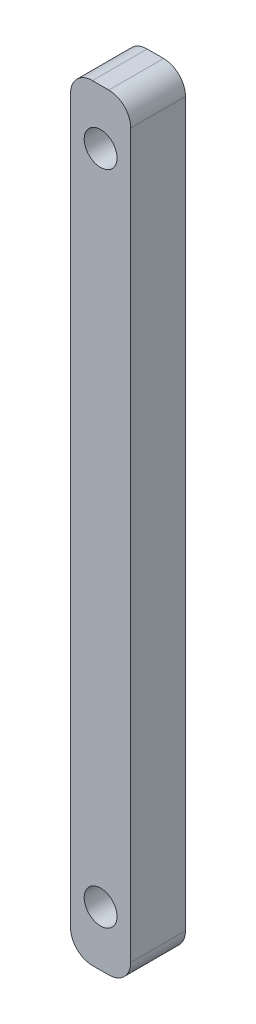
ISO-10303-21;
HEADER;
FILE_DESCRIPTION(('STEP AP214'),'2;1');
FILE_NAME('part.step','',(''),(''),'','','');
FILE_SCHEMA(('AUTOMOTIVE_DESIGN { 1 0 10303 214 1 1 1 1 }'));
ENDSEC;
DATA;
#1=APPLICATION_CONTEXT('core data for automotive mechanical design processes');
#2=APPLICATION_PROTOCOL_DEFINITION('international standard','automotive_design',2000,#1);
#3=PRODUCT_CONTEXT('',#1,'mechanical');
#4=PRODUCT('Part','Part','',(#3));
#5=PRODUCT_RELATED_PRODUCT_CATEGORY('part','',(#4));
#6=PRODUCT_DEFINITION_FORMATION('','',#4);
#7=PRODUCT_DEFINITION_CONTEXT('part definition',#1,'design');
#8=PRODUCT_DEFINITION('design','',#6,#7);
#9=PRODUCT_DEFINITION_SHAPE('','',#8);
#10=(LENGTH_UNIT() NAMED_UNIT(*) SI_UNIT(.MILLI.,.METRE.));
#11=(NAMED_UNIT(*) PLANE_ANGLE_UNIT() SI_UNIT($,.RADIAN.));
#12=(NAMED_UNIT(*) SI_UNIT($,.STERADIAN.) SOLID_ANGLE_UNIT());
#13=UNCERTAINTY_MEASURE_WITH_UNIT(LENGTH_MEASURE(1.E-05),#10,'distance_accuracy_value','');
#14=(GEOMETRIC_REPRESENTATION_CONTEXT(3) GLOBAL_UNCERTAINTY_ASSIGNED_CONTEXT((#13)) GLOBAL_UNIT_ASSIGNED_CONTEXT((#10,
#11,#12)) REPRESENTATION_CONTEXT('',''));
#15=CARTESIAN_POINT('',(0.,0.,0.));
#16=DIRECTION('',(0.,0.,1.));
#17=DIRECTION('',(1.,0.,0.));
#18=AXIS2_PLACEMENT_3D('',#15,#16,#17);
#19=CARTESIAN_POINT('',(-2.75,-35.,5.));
#20=DIRECTION('',(1.,0.,0.));
#21=DIRECTION('',(0.,0.,-1.));
#22=AXIS2_PLACEMENT_3D('',#19,#20,#21);
#23=PLANE('',#22);
#24=DIRECTION('',(0.,-1.,0.));
#25=VECTOR('',#24,1.);
#26=CARTESIAN_POINT('',(-2.75,-35.,0.));
#27=LINE('',#26,#25);
#28=CARTESIAN_POINT('',(-2.75,33.,0.));
#29=VERTEX_POINT('',#28);
#30=CARTESIAN_POINT('',(-2.75,-33.,0.));
#31=VERTEX_POINT('',#30);
#32=EDGE_CURVE('E134',#29,#31,#27,.T.);
#33=ORIENTED_EDGE('',*,*,#32,.T.);
#34=DIRECTION('',(0.,0.,-1.));
#35=VECTOR('',#34,1.);
#36=CARTESIAN_POINT('',(-2.75,-33.,5.));
#37=LINE('',#36,#35);
#38=CARTESIAN_POINT('',(-2.75,-33.,5.));
#39=VERTEX_POINT('',#38);
#40=EDGE_CURVE('E112',#31,#39,#37,.F.);
#41=ORIENTED_EDGE('',*,*,#40,.T.);
#42=DIRECTION('',(0.,-1.,0.));
#43=VECTOR('',#42,1.);
#44=CARTESIAN_POINT('',(-2.75,-35.,5.));
#45=LINE('',#44,#43);
#46=CARTESIAN_POINT('',(-2.75,33.,5.));
#47=VERTEX_POINT('',#46);
#48=EDGE_CURVE('E144',#47,#39,#45,.T.);
#49=ORIENTED_EDGE('',*,*,#48,.F.);
#50=DIRECTION('',(0.,0.,-1.));
#51=VECTOR('',#50,1.);
#52=CARTESIAN_POINT('',(-2.75,33.,5.));
#53=LINE('',#52,#51);
#54=EDGE_CURVE('E117',#47,#29,#53,.T.);
#55=ORIENTED_EDGE('',*,*,#54,.T.);
#56=EDGE_LOOP('',(#33,#41,#49,#55));
#57=FACE_BOUND('',#56,.T.);
#58=ADVANCED_FACE('F41',(#57),#23,.F.);
#59=CARTESIAN_POINT('',(2.75,-35.,5.));
#60=DIRECTION('',(0.,1.,0.));
#61=DIRECTION('',(0.,0.,1.));
#62=AXIS2_PLACEMENT_3D('',#59,#60,#61);
#63=PLANE('',#62);
#64=DIRECTION('',(1.,0.,0.));
#65=VECTOR('',#64,1.);
#66=CARTESIAN_POINT('',(2.75,-35.,5.));
#67=LINE('',#66,#65);
#68=CARTESIAN_POINT('',(-0.749999999999999,-35.,5.));
#69=VERTEX_POINT('',#68);
#70=CARTESIAN_POINT('',(0.75,-35.,5.));
#71=VERTEX_POINT('',#70);
#72=EDGE_CURVE('E127',#69,#71,#67,.T.);
#73=ORIENTED_EDGE('',*,*,#72,.F.);
#74=DIRECTION('',(0.,0.,-1.));
#75=VECTOR('',#74,1.);
#76=CARTESIAN_POINT('',(-0.749999999999999,-35.,5.));
#77=LINE('',#76,#75);
#78=CARTESIAN_POINT('',(-0.749999999999999,-35.,0.));
#79=VERTEX_POINT('',#78);
#80=EDGE_CURVE('E111',#69,#79,#77,.T.);
#81=ORIENTED_EDGE('',*,*,#80,.T.);
#82=DIRECTION('',(1.,0.,0.));
#83=VECTOR('',#82,1.);
#84=CARTESIAN_POINT('',(2.75,-35.,0.));
#85=LINE('',#84,#83);
#86=CARTESIAN_POINT('',(0.75,-35.,0.));
#87=VERTEX_POINT('',#86);
#88=EDGE_CURVE('E124',#79,#87,#85,.T.);
#89=ORIENTED_EDGE('',*,*,#88,.T.);
#90=DIRECTION('',(0.,0.,-1.));
#91=VECTOR('',#90,1.);
#92=CARTESIAN_POINT('',(0.75,-35.,5.));
#93=LINE('',#92,#91);
#94=EDGE_CURVE('E129',#87,#71,#93,.F.);
#95=ORIENTED_EDGE('',*,*,#94,.T.);
#96=EDGE_LOOP('',(#73,#81,#89,#95));
#97=FACE_BOUND('',#96,.T.);
#98=ADVANCED_FACE('F123',(#97),#63,.F.);
#99=CARTESIAN_POINT('',(2.75,-35.,5.));
#100=DIRECTION('',(-1.,0.,0.));
#101=DIRECTION('',(0.,0.,1.));
#102=AXIS2_PLACEMENT_3D('',#99,#100,#101);
#103=PLANE('',#102);
#104=DIRECTION('',(0.,1.,0.));
#105=VECTOR('',#104,1.);
#106=CARTESIAN_POINT('',(2.75,-35.,5.));
#107=LINE('',#106,#105);
#108=CARTESIAN_POINT('',(2.75,-33.,5.));
#109=VERTEX_POINT('',#108);
#110=CARTESIAN_POINT('',(2.75,33.,5.));
#111=VERTEX_POINT('',#110);
#112=EDGE_CURVE('E170',#109,#111,#107,.T.);
#113=ORIENTED_EDGE('',*,*,#112,.F.);
#114=DIRECTION('',(0.,0.,-1.));
#115=VECTOR('',#114,1.);
#116=CARTESIAN_POINT('',(2.75,-33.,5.));
#117=LINE('',#116,#115);
#118=CARTESIAN_POINT('',(2.75,-33.,0.));
#119=VERTEX_POINT('',#118);
#120=EDGE_CURVE('E163',#109,#119,#117,.T.);
#121=ORIENTED_EDGE('',*,*,#120,.T.);
#122=DIRECTION('',(0.,1.,0.));
#123=VECTOR('',#122,1.);
#124=CARTESIAN_POINT('',(2.75,-35.,0.));
#125=LINE('',#124,#123);
#126=CARTESIAN_POINT('',(2.75,33.,0.));
#127=VERTEX_POINT('',#126);
#128=EDGE_CURVE('E133',#119,#127,#125,.T.);
#129=ORIENTED_EDGE('',*,*,#128,.T.);
#130=DIRECTION('',(0.,0.,-1.));
#131=VECTOR('',#130,1.);
#132=CARTESIAN_POINT('',(2.75,33.,5.));
#133=LINE('',#132,#131);
#134=EDGE_CURVE('E161',#127,#111,#133,.F.);
#135=ORIENTED_EDGE('',*,*,#134,.T.);
#136=EDGE_LOOP('',(#113,#121,#129,#135));
#137=FACE_BOUND('',#136,.T.);
#138=ADVANCED_FACE('F168',(#137),#103,.F.);
#139=CARTESIAN_POINT('',(2.75,35.,5.));
#140=DIRECTION('',(0.,-1.,0.));
#141=DIRECTION('',(0.,0.,-1.));
#142=AXIS2_PLACEMENT_3D('',#139,#140,#141);
#143=PLANE('',#142);
#144=DIRECTION('',(-1.,0.,0.));
#145=VECTOR('',#144,1.);
#146=CARTESIAN_POINT('',(2.75,35.,5.));
#147=LINE('',#146,#145);
#148=CARTESIAN_POINT('',(0.75,35.,5.));
#149=VERTEX_POINT('',#148);
#150=CARTESIAN_POINT('',(-0.749999999999999,35.,5.));
#151=VERTEX_POINT('',#150);
#152=EDGE_CURVE('E145',#149,#151,#147,.T.);
#153=ORIENTED_EDGE('',*,*,#152,.F.);
#154=DIRECTION('',(0.,0.,-1.));
#155=VECTOR('',#154,1.);
#156=CARTESIAN_POINT('',(0.75,35.,5.));
#157=LINE('',#156,#155);
#158=CARTESIAN_POINT('',(0.75,35.,0.));
#159=VERTEX_POINT('',#158);
#160=EDGE_CURVE('E11',#149,#159,#157,.T.);
#161=ORIENTED_EDGE('',*,*,#160,.T.);
#162=DIRECTION('',(-1.,0.,0.));
#163=VECTOR('',#162,1.);
#164=CARTESIAN_POINT('',(2.75,35.,0.));
#165=LINE('',#164,#163);
#166=CARTESIAN_POINT('',(-0.749999999999999,35.,0.));
#167=VERTEX_POINT('',#166);
#168=EDGE_CURVE('E137',#159,#167,#165,.T.);
#169=ORIENTED_EDGE('',*,*,#168,.T.);
#170=DIRECTION('',(0.,0.,-1.));
#171=VECTOR('',#170,1.);
#172=CARTESIAN_POINT('',(-0.749999999999999,35.,5.));
#173=LINE('',#172,#171);
#174=EDGE_CURVE('E49',#167,#151,#173,.F.);
#175=ORIENTED_EDGE('',*,*,#174,.T.);
#176=EDGE_LOOP('',(#153,#161,#169,#175));
#177=FACE_BOUND('',#176,.T.);
#178=ADVANCED_FACE('F177',(#177),#143,.F.);
#179=CARTESIAN_POINT('',(0.,0.,5.));
#180=DIRECTION('',(0.,0.,1.));
#181=DIRECTION('',(1.,0.,0.));
#182=AXIS2_PLACEMENT_3D('',#179,#180,#181);
#183=PLANE('',#182);
#184=CARTESIAN_POINT('',(0.,30.,5.));
#185=DIRECTION('',(0.,0.,1.));
#186=DIRECTION('',(1.,0.,0.));
#187=AXIS2_PLACEMENT_3D('',#184,#185,#186);
#188=CIRCLE('',#187,1.5);
#189=CARTESIAN_POINT('',(1.5,30.,5.));
#190=VERTEX_POINT('',#189);
#191=EDGE_CURVE('E190',#190,#190,#188,.T.);
#192=ORIENTED_EDGE('',*,*,#191,.F.);
#193=EDGE_LOOP('',(#192));
#194=FACE_BOUND('',#193,.T.);
#195=CARTESIAN_POINT('',(0.,-30.,5.));
#196=DIRECTION('',(0.,0.,1.));
#197=DIRECTION('',(1.,0.,0.));
#198=AXIS2_PLACEMENT_3D('',#195,#196,#197);
#199=CIRCLE('',#198,1.5);
#200=CARTESIAN_POINT('',(1.50000000000001,-30.,5.));
#201=VERTEX_POINT('',#200);
#202=EDGE_CURVE('E187',#201,#201,#199,.T.);
#203=ORIENTED_EDGE('',*,*,#202,.F.);
#204=EDGE_LOOP('',(#203));
#205=FACE_BOUND('',#204,.T.);
#206=ORIENTED_EDGE('',*,*,#48,.T.);
#207=CARTESIAN_POINT('',(-0.749999999999999,-33.,5.));
#208=DIRECTION('',(0.,0.,1.));
#209=DIRECTION('',(1.,0.,0.));
#210=AXIS2_PLACEMENT_3D('',#207,#208,#209);
#211=CIRCLE('',#210,2.);
#212=EDGE_CURVE('E159',#39,#69,#211,.T.);
#213=ORIENTED_EDGE('',*,*,#212,.T.);
#214=ORIENTED_EDGE('',*,*,#72,.T.);
#215=CARTESIAN_POINT('',(0.75,-33.,5.));
#216=DIRECTION('',(0.,0.,1.));
#217=DIRECTION('',(1.,0.,0.));
#218=AXIS2_PLACEMENT_3D('',#215,#216,#217);
#219=CIRCLE('',#218,2.);
#220=EDGE_CURVE('E157',#71,#109,#219,.T.);
#221=ORIENTED_EDGE('',*,*,#220,.T.);
#222=ORIENTED_EDGE('',*,*,#112,.T.);
#223=CARTESIAN_POINT('',(0.75,33.,5.));
#224=DIRECTION('',(0.,0.,1.));
#225=DIRECTION('',(1.,0.,0.));
#226=AXIS2_PLACEMENT_3D('',#223,#224,#225);
#227=CIRCLE('',#226,2.);
#228=EDGE_CURVE('E62',#111,#149,#227,.T.);
#229=ORIENTED_EDGE('',*,*,#228,.T.);
#230=ORIENTED_EDGE('',*,*,#152,.T.);
#231=CARTESIAN_POINT('',(-0.749999999999999,33.,5.));
#232=DIRECTION('',(0.,0.,1.));
#233=DIRECTION('',(1.,0.,0.));
#234=AXIS2_PLACEMENT_3D('',#231,#232,#233);
#235=CIRCLE('',#234,2.);
#236=EDGE_CURVE('E154',#151,#47,#235,.T.);
#237=ORIENTED_EDGE('',*,*,#236,.T.);
#238=EDGE_LOOP('',(#206,#213,#214,#221,#222,#229,#230,#237));
#239=FACE_BOUND('',#238,.T.);
#240=ADVANCED_FACE('F205',(#194,#205,#239),#183,.T.);
#241=CARTESIAN_POINT('',(0.,0.,0.));
#242=DIRECTION('',(0.,0.,1.));
#243=DIRECTION('',(1.,0.,0.));
#244=AXIS2_PLACEMENT_3D('',#241,#242,#243);
#245=PLANE('',#244);
#246=CARTESIAN_POINT('',(0.,30.,0.));
#247=DIRECTION('',(0.,0.,1.));
#248=DIRECTION('',(1.,0.,0.));
#249=AXIS2_PLACEMENT_3D('',#246,#247,#248);
#250=CIRCLE('',#249,1.5);
#251=CARTESIAN_POINT('',(1.5,30.,0.));
#252=VERTEX_POINT('',#251);
#253=EDGE_CURVE('E139',#252,#252,#250,.T.);
#254=ORIENTED_EDGE('',*,*,#253,.T.);
#255=EDGE_LOOP('',(#254));
#256=FACE_BOUND('',#255,.T.);
#257=CARTESIAN_POINT('',(0.,-30.,0.));
#258=DIRECTION('',(0.,0.,1.));
#259=DIRECTION('',(1.,0.,0.));
#260=AXIS2_PLACEMENT_3D('',#257,#258,#259);
#261=CIRCLE('',#260,1.5);
#262=CARTESIAN_POINT('',(1.50000000000001,-30.,0.));
#263=VERTEX_POINT('',#262);
#264=EDGE_CURVE('E184',#263,#263,#261,.T.);
#265=ORIENTED_EDGE('',*,*,#264,.T.);
#266=EDGE_LOOP('',(#265));
#267=FACE_BOUND('',#266,.T.);
#268=ORIENTED_EDGE('',*,*,#88,.F.);
#269=CARTESIAN_POINT('',(-0.749999999999999,-33.,0.));
#270=DIRECTION('',(0.,0.,1.));
#271=DIRECTION('',(1.,0.,0.));
#272=AXIS2_PLACEMENT_3D('',#269,#270,#271);
#273=CIRCLE('',#272,2.);
#274=EDGE_CURVE('E107',#79,#31,#273,.F.);
#275=ORIENTED_EDGE('',*,*,#274,.T.);
#276=ORIENTED_EDGE('',*,*,#32,.F.);
#277=CARTESIAN_POINT('',(-0.749999999999999,33.,0.));
#278=DIRECTION('',(0.,0.,1.));
#279=DIRECTION('',(1.,0.,0.));
#280=AXIS2_PLACEMENT_3D('',#277,#278,#279);
#281=CIRCLE('',#280,2.);
#282=EDGE_CURVE('E128',#29,#167,#281,.F.);
#283=ORIENTED_EDGE('',*,*,#282,.T.);
#284=ORIENTED_EDGE('',*,*,#168,.F.);
#285=CARTESIAN_POINT('',(0.75,33.,0.));
#286=DIRECTION('',(0.,0.,1.));
#287=DIRECTION('',(1.,0.,0.));
#288=AXIS2_PLACEMENT_3D('',#285,#286,#287);
#289=CIRCLE('',#288,2.);
#290=EDGE_CURVE('E148',#159,#127,#289,.F.);
#291=ORIENTED_EDGE('',*,*,#290,.T.);
#292=ORIENTED_EDGE('',*,*,#128,.F.);
#293=CARTESIAN_POINT('',(0.75,-33.,0.));
#294=DIRECTION('',(0.,0.,1.));
#295=DIRECTION('',(1.,0.,0.));
#296=AXIS2_PLACEMENT_3D('',#293,#294,#295);
#297=CIRCLE('',#296,2.);
#298=EDGE_CURVE('E118',#119,#87,#297,.F.);
#299=ORIENTED_EDGE('',*,*,#298,.T.);
#300=EDGE_LOOP('',(#268,#275,#276,#283,#284,#291,#292,#299));
#301=FACE_BOUND('',#300,.T.);
#302=ADVANCED_FACE('F131',(#256,#267,#301),#245,.F.);
#303=CARTESIAN_POINT('',(0.,-30.,0.));
#304=DIRECTION('',(0.,0.,1.));
#305=DIRECTION('',(1.,0.,0.));
#306=AXIS2_PLACEMENT_3D('',#303,#304,#305);
#307=CYLINDRICAL_SURFACE('',#306,1.5);
#308=ORIENTED_EDGE('',*,*,#264,.F.);
#309=EDGE_LOOP('',(#308));
#310=FACE_BOUND('',#309,.T.);
#311=ORIENTED_EDGE('',*,*,#202,.T.);
#312=EDGE_LOOP('',(#311));
#313=FACE_BOUND('',#312,.T.);
#314=ADVANCED_FACE('F201',(#310,#313),#307,.F.);
#315=CARTESIAN_POINT('',(0.,30.,0.));
#316=DIRECTION('',(0.,0.,1.));
#317=DIRECTION('',(1.,0.,0.));
#318=AXIS2_PLACEMENT_3D('',#315,#316,#317);
#319=CYLINDRICAL_SURFACE('',#318,1.5);
#320=ORIENTED_EDGE('',*,*,#253,.F.);
#321=EDGE_LOOP('',(#320));
#322=FACE_BOUND('',#321,.T.);
#323=ORIENTED_EDGE('',*,*,#191,.T.);
#324=EDGE_LOOP('',(#323));
#325=FACE_BOUND('',#324,.T.);
#326=ADVANCED_FACE('F198',(#322,#325),#319,.F.);
#327=CARTESIAN_POINT('',(-0.749999999999999,-33.,5.));
#328=DIRECTION('',(0.,0.,-1.));
#329=DIRECTION('',(-1.,0.,0.));
#330=AXIS2_PLACEMENT_3D('',#327,#328,#329);
#331=CYLINDRICAL_SURFACE('',#330,2.);
#332=ORIENTED_EDGE('',*,*,#212,.F.);
#333=ORIENTED_EDGE('',*,*,#40,.F.);
#334=ORIENTED_EDGE('',*,*,#274,.F.);
#335=ORIENTED_EDGE('',*,*,#80,.F.);
#336=EDGE_LOOP('',(#332,#333,#334,#335));
#337=FACE_BOUND('',#336,.T.);
#338=ADVANCED_FACE('F110',(#337),#331,.T.);
#339=CARTESIAN_POINT('',(0.75,-33.,5.));
#340=DIRECTION('',(0.,0.,-1.));
#341=DIRECTION('',(-1.,0.,0.));
#342=AXIS2_PLACEMENT_3D('',#339,#340,#341);
#343=CYLINDRICAL_SURFACE('',#342,2.);
#344=ORIENTED_EDGE('',*,*,#220,.F.);
#345=ORIENTED_EDGE('',*,*,#94,.F.);
#346=ORIENTED_EDGE('',*,*,#298,.F.);
#347=ORIENTED_EDGE('',*,*,#120,.F.);
#348=EDGE_LOOP('',(#344,#345,#346,#347));
#349=FACE_BOUND('',#348,.T.);
#350=ADVANCED_FACE('F218',(#349),#343,.T.);
#351=CARTESIAN_POINT('',(0.75,33.,5.));
#352=DIRECTION('',(0.,0.,-1.));
#353=DIRECTION('',(-1.,0.,0.));
#354=AXIS2_PLACEMENT_3D('',#351,#352,#353);
#355=CYLINDRICAL_SURFACE('',#354,2.);
#356=ORIENTED_EDGE('',*,*,#228,.F.);
#357=ORIENTED_EDGE('',*,*,#134,.F.);
#358=ORIENTED_EDGE('',*,*,#290,.F.);
#359=ORIENTED_EDGE('',*,*,#160,.F.);
#360=EDGE_LOOP('',(#356,#357,#358,#359));
#361=FACE_BOUND('',#360,.T.);
#362=ADVANCED_FACE('F176',(#361),#355,.T.);
#363=CARTESIAN_POINT('',(-0.749999999999999,33.,5.));
#364=DIRECTION('',(0.,0.,-1.));
#365=DIRECTION('',(-1.,0.,0.));
#366=AXIS2_PLACEMENT_3D('',#363,#364,#365);
#367=CYLINDRICAL_SURFACE('',#366,2.);
#368=ORIENTED_EDGE('',*,*,#236,.F.);
#369=ORIENTED_EDGE('',*,*,#174,.F.);
#370=ORIENTED_EDGE('',*,*,#282,.F.);
#371=ORIENTED_EDGE('',*,*,#54,.F.);
#372=EDGE_LOOP('',(#368,#369,#370,#371));
#373=FACE_BOUND('',#372,.T.);
#374=ADVANCED_FACE('F43',(#373),#367,.T.);
#375=CLOSED_SHELL('',(#58,#98,#138,#178,#240,#302,#314,#326,#338,#350,#362,#374));
#376=MANIFOLD_SOLID_BREP('B2',#375);
#377=ADVANCED_BREP_SHAPE_REPRESENTATION('',(#18,#376),#14);
#378=SHAPE_DEFINITION_REPRESENTATION(#9,#377);
ENDSEC;
END-ISO-10303-21;
